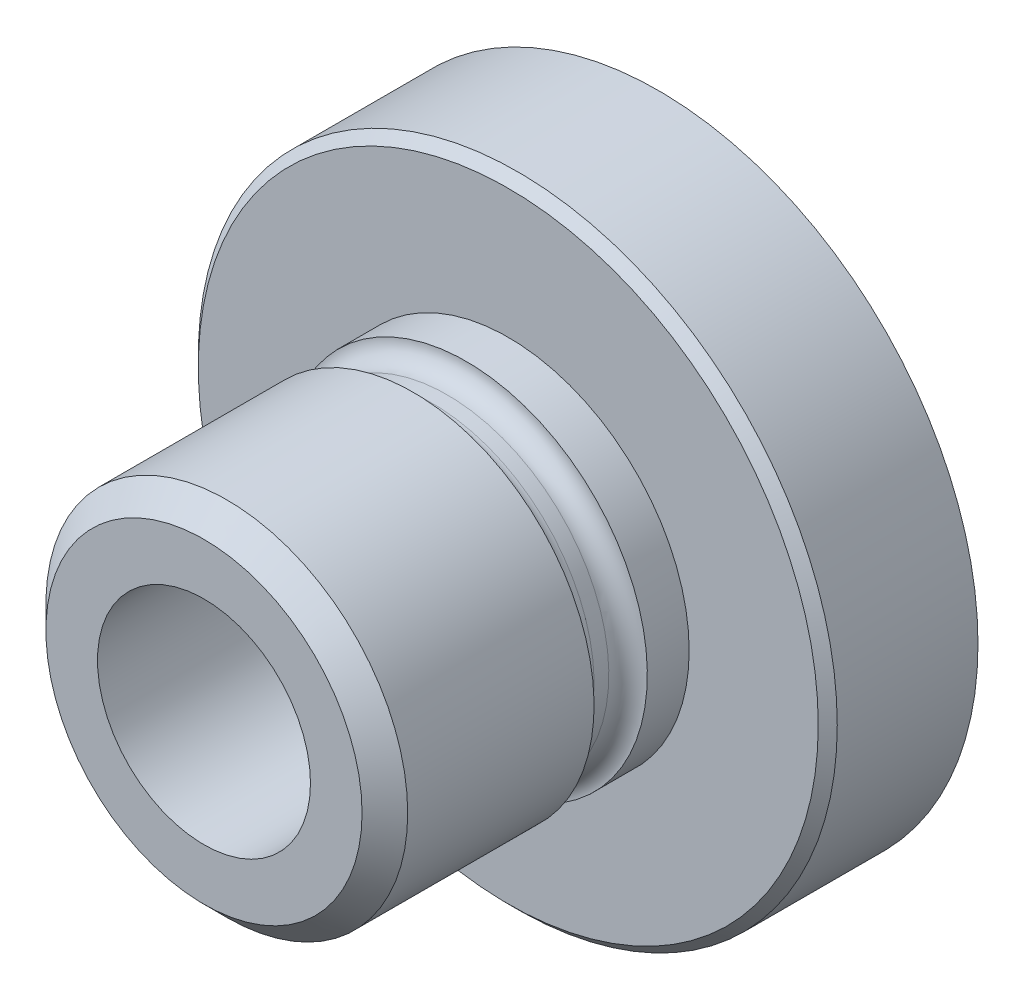
ISO-10303-21;
HEADER;
FILE_DESCRIPTION(('STEP AP214'),'2;1');
FILE_NAME('part.step','',(''),(''),'','','');
FILE_SCHEMA(('AUTOMOTIVE_DESIGN { 1 0 10303 214 1 1 1 1 }'));
ENDSEC;
DATA;
#1=APPLICATION_CONTEXT('core data for automotive mechanical design processes');
#2=APPLICATION_PROTOCOL_DEFINITION('international standard','automotive_design',2000,#1);
#3=PRODUCT_CONTEXT('',#1,'mechanical');
#4=PRODUCT('Part','Part','',(#3));
#5=PRODUCT_RELATED_PRODUCT_CATEGORY('part','',(#4));
#6=PRODUCT_DEFINITION_FORMATION('','',#4);
#7=PRODUCT_DEFINITION_CONTEXT('part definition',#1,'design');
#8=PRODUCT_DEFINITION('design','',#6,#7);
#9=PRODUCT_DEFINITION_SHAPE('','',#8);
#10=(LENGTH_UNIT() NAMED_UNIT(*) SI_UNIT(.MILLI.,.METRE.));
#11=(NAMED_UNIT(*) PLANE_ANGLE_UNIT() SI_UNIT($,.RADIAN.));
#12=(NAMED_UNIT(*) SI_UNIT($,.STERADIAN.) SOLID_ANGLE_UNIT());
#13=UNCERTAINTY_MEASURE_WITH_UNIT(LENGTH_MEASURE(1.E-05),#10,'distance_accuracy_value','');
#14=(GEOMETRIC_REPRESENTATION_CONTEXT(3) GLOBAL_UNCERTAINTY_ASSIGNED_CONTEXT((#13)) GLOBAL_UNIT_ASSIGNED_CONTEXT((#10,
#11,#12)) REPRESENTATION_CONTEXT('',''));
#15=CARTESIAN_POINT('',(0.,0.,0.));
#16=DIRECTION('',(0.,0.,1.));
#17=DIRECTION('',(1.,0.,0.));
#18=AXIS2_PLACEMENT_3D('',#15,#16,#17);
#19=CARTESIAN_POINT('',(0.,0.,23.9));
#20=DIRECTION('',(0.,0.,-1.));
#21=DIRECTION('',(-1.,0.,0.));
#22=AXIS2_PLACEMENT_3D('',#19,#20,#21);
#23=CYLINDRICAL_SURFACE('',#22,9.5123);
#24=CARTESIAN_POINT('',(0.,0.,7.9));
#25=DIRECTION('',(0.,0.,1.));
#26=DIRECTION('',(1.,0.,0.));
#27=AXIS2_PLACEMENT_3D('',#24,#25,#26);
#28=CIRCLE('',#27,9.5123);
#29=CARTESIAN_POINT('',(9.5123,0.,7.9));
#30=VERTEX_POINT('',#29);
#31=EDGE_CURVE('E55',#30,#30,#28,.T.);
#32=ORIENTED_EDGE('',*,*,#31,.T.);
#33=EDGE_LOOP('',(#32));
#34=FACE_BOUND('',#33,.T.);
#35=CARTESIAN_POINT('',(0.,0.,10.1));
#36=DIRECTION('',(0.,0.,1.));
#37=DIRECTION('',(0.,-1.,0.));
#38=AXIS2_PLACEMENT_3D('',#35,#36,#37);
#39=CIRCLE('',#38,9.51230000000001);
#40=CARTESIAN_POINT('',(0.,-9.51230000000001,10.1));
#41=VERTEX_POINT('',#40);
#42=EDGE_CURVE('E67',#41,#41,#39,.T.);
#43=ORIENTED_EDGE('',*,*,#42,.F.);
#44=EDGE_LOOP('',(#43));
#45=FACE_BOUND('',#44,.T.);
#46=ADVANCED_FACE('F32',(#34,#45),#23,.T.);
#47=CARTESIAN_POINT('',(0.,0.,7.9));
#48=DIRECTION('',(0.,0.,-1.));
#49=DIRECTION('',(-1.,0.,0.));
#50=AXIS2_PLACEMENT_3D('',#47,#48,#49);
#51=CYLINDRICAL_SURFACE('',#50,16.8);
#52=CARTESIAN_POINT('',(0.,0.,7.39999999999999));
#53=DIRECTION('',(0.,0.,1.));
#54=DIRECTION('',(1.,0.,0.));
#55=AXIS2_PLACEMENT_3D('',#52,#53,#54);
#56=CIRCLE('',#55,16.8);
#57=CARTESIAN_POINT('',(16.8,0.,7.39999999999999));
#58=VERTEX_POINT('',#57);
#59=EDGE_CURVE('E10',#58,#58,#56,.F.);
#60=ORIENTED_EDGE('',*,*,#59,.T.);
#61=EDGE_LOOP('',(#60));
#62=FACE_BOUND('',#61,.T.);
#63=CARTESIAN_POINT('',(0.,0.,0.));
#64=DIRECTION('',(0.,0.,1.));
#65=DIRECTION('',(1.,0.,0.));
#66=AXIS2_PLACEMENT_3D('',#63,#64,#65);
#67=CIRCLE('',#66,16.8);
#68=CARTESIAN_POINT('',(16.8,0.,0.));
#69=VERTEX_POINT('',#68);
#70=EDGE_CURVE('E52',#69,#69,#67,.T.);
#71=ORIENTED_EDGE('',*,*,#70,.T.);
#72=EDGE_LOOP('',(#71));
#73=FACE_BOUND('',#72,.T.);
#74=ADVANCED_FACE('F101',(#62,#73),#51,.T.);
#75=CARTESIAN_POINT('',(0.,0.,7.9));
#76=DIRECTION('',(0.,0.,1.));
#77=DIRECTION('',(1.,0.,0.));
#78=AXIS2_PLACEMENT_3D('',#75,#76,#77);
#79=PLANE('',#78);
#80=CARTESIAN_POINT('',(0.,0.,7.9));
#81=DIRECTION('',(0.,0.,1.));
#82=DIRECTION('',(1.,0.,0.));
#83=AXIS2_PLACEMENT_3D('',#80,#81,#82);
#84=CIRCLE('',#83,16.3);
#85=CARTESIAN_POINT('',(16.3,0.,7.9));
#86=VERTEX_POINT('',#85);
#87=EDGE_CURVE('E39',#86,#86,#84,.T.);
#88=ORIENTED_EDGE('',*,*,#87,.T.);
#89=EDGE_LOOP('',(#88));
#90=FACE_BOUND('',#89,.T.);
#91=ORIENTED_EDGE('',*,*,#31,.F.);
#92=EDGE_LOOP('',(#91));
#93=FACE_BOUND('',#92,.T.);
#94=ADVANCED_FACE('F106',(#90,#93),#79,.T.);
#95=CARTESIAN_POINT('',(0.,0.,0.));
#96=DIRECTION('',(0.,0.,1.));
#97=DIRECTION('',(1.,0.,0.));
#98=AXIS2_PLACEMENT_3D('',#95,#96,#97);
#99=PLANE('',#98);
#100=CARTESIAN_POINT('',(0.,0.,0.));
#101=DIRECTION('',(0.,0.,1.));
#102=DIRECTION('',(1.,0.,0.));
#103=AXIS2_PLACEMENT_3D('',#100,#101,#102);
#104=CIRCLE('',#103,5.59999999999999);
#105=CARTESIAN_POINT('',(5.59999999999999,0.,0.));
#106=VERTEX_POINT('',#105);
#107=EDGE_CURVE('E70',#106,#106,#104,.F.);
#108=ORIENTED_EDGE('',*,*,#107,.F.);
#109=EDGE_LOOP('',(#108));
#110=FACE_BOUND('',#109,.T.);
#111=ORIENTED_EDGE('',*,*,#70,.F.);
#112=EDGE_LOOP('',(#111));
#113=FACE_BOUND('',#112,.T.);
#114=ADVANCED_FACE('F112',(#110,#113),#99,.F.);
#115=CARTESIAN_POINT('',(0.,0.,11.1123));
#116=DIRECTION('',(0.,0.,1.));
#117=DIRECTION('',(0.,-1.,0.));
#118=AXIS2_PLACEMENT_3D('',#115,#116,#117);
#119=TOROIDAL_SURFACE('',#118,9.51230000000001,1.01229999999999);
#120=ORIENTED_EDGE('',*,*,#42,.T.);
#121=EDGE_LOOP('',(#120));
#122=FACE_BOUND('',#121,.T.);
#123=CARTESIAN_POINT('',(0.,0.,11.1123));
#124=DIRECTION('',(0.,0.,1.));
#125=DIRECTION('',(0.,-1.,0.));
#126=AXIS2_PLACEMENT_3D('',#123,#124,#125);
#127=CIRCLE('',#126,8.50000000000001);
#128=CARTESIAN_POINT('',(0.,-8.50000000000001,11.1123));
#129=VERTEX_POINT('',#128);
#130=EDGE_CURVE('E58',#129,#129,#127,.T.);
#131=ORIENTED_EDGE('',*,*,#130,.F.);
#132=EDGE_LOOP('',(#131));
#133=FACE_BOUND('',#132,.T.);
#134=ADVANCED_FACE('F114',(#122,#133),#119,.F.);
#135=CARTESIAN_POINT('',(0.,0.,23.9));
#136=DIRECTION('',(0.,0.,1.));
#137=DIRECTION('',(0.,-1.,0.));
#138=AXIS2_PLACEMENT_3D('',#135,#136,#137);
#139=CYLINDRICAL_SURFACE('',#138,8.50000000000002);
#140=ORIENTED_EDGE('',*,*,#130,.T.);
#141=EDGE_LOOP('',(#140));
#142=FACE_BOUND('',#141,.T.);
#143=CARTESIAN_POINT('',(0.,0.,11.8877));
#144=DIRECTION('',(0.,0.,1.));
#145=DIRECTION('',(0.,-1.,0.));
#146=AXIS2_PLACEMENT_3D('',#143,#144,#145);
#147=CIRCLE('',#146,8.50000000000002);
#148=CARTESIAN_POINT('',(0.,-8.50000000000003,11.8877));
#149=VERTEX_POINT('',#148);
#150=EDGE_CURVE('E61',#149,#149,#147,.T.);
#151=ORIENTED_EDGE('',*,*,#150,.F.);
#152=EDGE_LOOP('',(#151));
#153=FACE_BOUND('',#152,.T.);
#154=ADVANCED_FACE('F119',(#142,#153),#139,.T.);
#155=CARTESIAN_POINT('',(0.,0.,11.8877));
#156=DIRECTION('',(0.,0.,1.));
#157=DIRECTION('',(0.,-1.,0.));
#158=AXIS2_PLACEMENT_3D('',#155,#156,#157);
#159=TOROIDAL_SURFACE('',#158,9.51230000000001,1.01229999999998);
#160=ORIENTED_EDGE('',*,*,#150,.T.);
#161=EDGE_LOOP('',(#160));
#162=FACE_BOUND('',#161,.T.);
#163=CARTESIAN_POINT('',(0.,0.,12.9));
#164=DIRECTION('',(0.,0.,1.));
#165=DIRECTION('',(0.,-1.,0.));
#166=AXIS2_PLACEMENT_3D('',#163,#164,#165);
#167=CIRCLE('',#166,9.51230000000001);
#168=CARTESIAN_POINT('',(0.,-9.51230000000001,12.9));
#169=VERTEX_POINT('',#168);
#170=EDGE_CURVE('E64',#169,#169,#167,.T.);
#171=ORIENTED_EDGE('',*,*,#170,.F.);
#172=EDGE_LOOP('',(#171));
#173=FACE_BOUND('',#172,.T.);
#174=ADVANCED_FACE('F84',(#162,#173),#159,.F.);
#175=CARTESIAN_POINT('',(0.,0.,23.9));
#176=DIRECTION('',(0.,0.,1.));
#177=DIRECTION('',(1.,0.,0.));
#178=AXIS2_PLACEMENT_3D('',#175,#176,#177);
#179=PLANE('',#178);
#180=CARTESIAN_POINT('',(0.,0.,23.9));
#181=DIRECTION('',(0.,0.,1.));
#182=DIRECTION('',(1.,0.,0.));
#183=AXIS2_PLACEMENT_3D('',#180,#181,#182);
#184=CIRCLE('',#183,5.59999999999999);
#185=CARTESIAN_POINT('',(5.59999999999999,0.,23.9));
#186=VERTEX_POINT('',#185);
#187=EDGE_CURVE('E73',#186,#186,#184,.T.);
#188=ORIENTED_EDGE('',*,*,#187,.F.);
#189=EDGE_LOOP('',(#188));
#190=FACE_BOUND('',#189,.T.);
#191=CARTESIAN_POINT('',(0.,0.,23.9));
#192=DIRECTION('',(0.,0.,1.));
#193=DIRECTION('',(1.,0.,0.));
#194=AXIS2_PLACEMENT_3D('',#191,#192,#193);
#195=CIRCLE('',#194,8.3123);
#196=CARTESIAN_POINT('',(8.3123,0.,23.9));
#197=VERTEX_POINT('',#196);
#198=EDGE_CURVE('E47',#197,#197,#195,.T.);
#199=ORIENTED_EDGE('',*,*,#198,.T.);
#200=EDGE_LOOP('',(#199));
#201=FACE_BOUND('',#200,.T.);
#202=ADVANCED_FACE('F80',(#190,#201),#179,.T.);
#203=CARTESIAN_POINT('',(0.,0.,22.7));
#204=DIRECTION('',(0.,0.,1.));
#205=DIRECTION('',(1.,0.,0.));
#206=AXIS2_PLACEMENT_3D('',#203,#204,#205);
#207=CIRCLE('',#206,9.5123);
#208=CARTESIAN_POINT('',(9.5123,0.,22.7));
#209=VERTEX_POINT('',#208);
#210=EDGE_CURVE('E43',#209,#209,#207,.F.);
#211=ORIENTED_EDGE('',*,*,#210,.T.);
#212=EDGE_LOOP('',(#211));
#213=FACE_BOUND('',#212,.T.);
#214=ORIENTED_EDGE('',*,*,#170,.T.);
#215=EDGE_LOOP('',(#214));
#216=FACE_BOUND('',#215,.T.);
#217=ADVANCED_FACE('F83',(#213,#216),#23,.T.);
#218=CARTESIAN_POINT('',(0.,0.,23.9));
#219=DIRECTION('',(0.,0.,-1.));
#220=DIRECTION('',(-1.,0.,0.));
#221=AXIS2_PLACEMENT_3D('',#218,#219,#220);
#222=CONICAL_SURFACE('',#221,8.3123,0.78539816339745);
#223=ORIENTED_EDGE('',*,*,#210,.F.);
#224=EDGE_LOOP('',(#223));
#225=FACE_BOUND('',#224,.T.);
#226=ORIENTED_EDGE('',*,*,#198,.F.);
#227=EDGE_LOOP('',(#226));
#228=FACE_BOUND('',#227,.T.);
#229=ADVANCED_FACE('F88',(#225,#228),#222,.T.);
#230=CARTESIAN_POINT('',(0.,0.,7.9));
#231=DIRECTION('',(0.,0.,-1.));
#232=DIRECTION('',(-1.,0.,0.));
#233=AXIS2_PLACEMENT_3D('',#230,#231,#232);
#234=CONICAL_SURFACE('',#233,16.3,0.785398163397441);
#235=ORIENTED_EDGE('',*,*,#59,.F.);
#236=EDGE_LOOP('',(#235));
#237=FACE_BOUND('',#236,.T.);
#238=ORIENTED_EDGE('',*,*,#87,.F.);
#239=EDGE_LOOP('',(#238));
#240=FACE_BOUND('',#239,.T.);
#241=ADVANCED_FACE('F34',(#237,#240),#234,.T.);
#242=CARTESIAN_POINT('',(0.,0.,-0.001000000000001));
#243=DIRECTION('',(0.,0.,1.));
#244=DIRECTION('',(1.,0.,0.));
#245=AXIS2_PLACEMENT_3D('',#242,#243,#244);
#246=CYLINDRICAL_SURFACE('',#245,5.59999999999999);
#247=ORIENTED_EDGE('',*,*,#187,.T.);
#248=EDGE_LOOP('',(#247));
#249=FACE_BOUND('',#248,.T.);
#250=ORIENTED_EDGE('',*,*,#107,.T.);
#251=EDGE_LOOP('',(#250));
#252=FACE_BOUND('',#251,.T.);
#253=ADVANCED_FACE('F77',(#249,#252),#246,.F.);
#254=CLOSED_SHELL('',(#46,#74,#94,#114,#134,#154,#174,#202,#217,#229,#241,#253));
#255=MANIFOLD_SOLID_BREP('B2',#254);
#256=ADVANCED_BREP_SHAPE_REPRESENTATION('',(#18,#255),#14);
#257=SHAPE_DEFINITION_REPRESENTATION(#9,#256);
ENDSEC;
END-ISO-10303-21;
